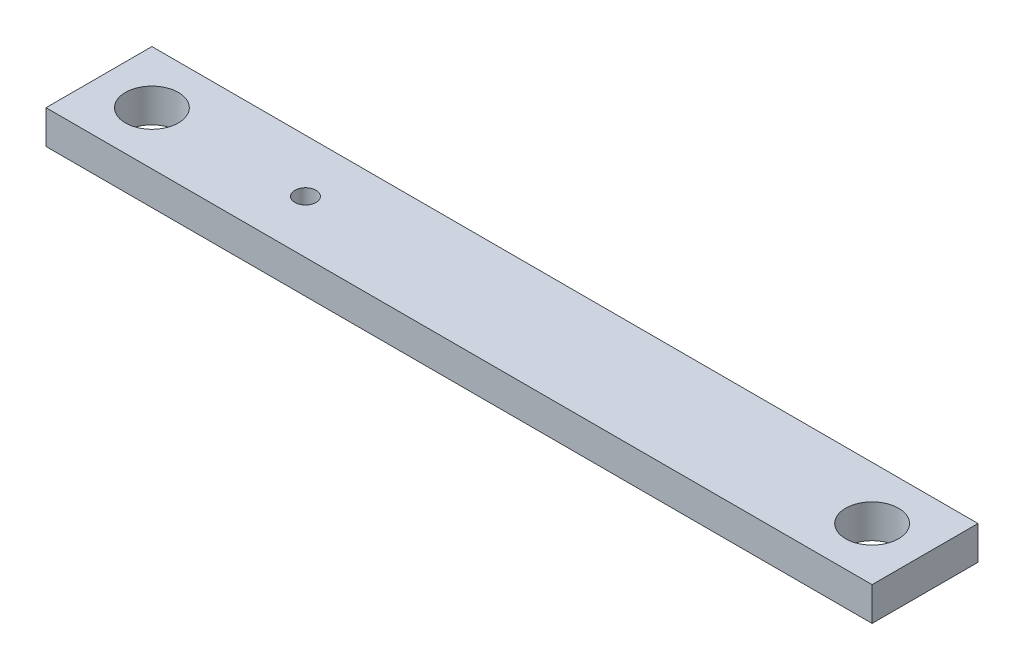
ISO-10303-21;
HEADER;
FILE_DESCRIPTION(('STEP AP214'),'2;1');
FILE_NAME('part.step','',(''),(''),'','','');
FILE_SCHEMA(('AUTOMOTIVE_DESIGN { 1 0 10303 214 1 1 1 1 }'));
ENDSEC;
DATA;
#1=APPLICATION_CONTEXT('core data for automotive mechanical design processes');
#2=APPLICATION_PROTOCOL_DEFINITION('international standard','automotive_design',2000,#1);
#3=PRODUCT_CONTEXT('',#1,'mechanical');
#4=PRODUCT('Part','Part','',(#3));
#5=PRODUCT_RELATED_PRODUCT_CATEGORY('part','',(#4));
#6=PRODUCT_DEFINITION_FORMATION('','',#4);
#7=PRODUCT_DEFINITION_CONTEXT('part definition',#1,'design');
#8=PRODUCT_DEFINITION('design','',#6,#7);
#9=PRODUCT_DEFINITION_SHAPE('','',#8);
#10=(LENGTH_UNIT() NAMED_UNIT(*) SI_UNIT(.MILLI.,.METRE.));
#11=(NAMED_UNIT(*) PLANE_ANGLE_UNIT() SI_UNIT($,.RADIAN.));
#12=(NAMED_UNIT(*) SI_UNIT($,.STERADIAN.) SOLID_ANGLE_UNIT());
#13=UNCERTAINTY_MEASURE_WITH_UNIT(LENGTH_MEASURE(1.E-05),#10,'distance_accuracy_value','');
#14=(GEOMETRIC_REPRESENTATION_CONTEXT(3) GLOBAL_UNCERTAINTY_ASSIGNED_CONTEXT((#13)) GLOBAL_UNIT_ASSIGNED_CONTEXT((#10,
#11,#12)) REPRESENTATION_CONTEXT('',''));
#15=CARTESIAN_POINT('',(0.,0.,0.));
#16=DIRECTION('',(0.,0.,1.));
#17=DIRECTION('',(1.,0.,0.));
#18=AXIS2_PLACEMENT_3D('',#15,#16,#17);
#19=CARTESIAN_POINT('',(39.,3.175,5.));
#20=DIRECTION('',(-1.,0.,0.));
#21=DIRECTION('',(0.,0.,1.));
#22=AXIS2_PLACEMENT_3D('',#19,#20,#21);
#23=PLANE('',#22);
#24=DIRECTION('',(0.,0.,-1.));
#25=VECTOR('',#24,1.);
#26=CARTESIAN_POINT('',(39.,0.,5.));
#27=LINE('',#26,#25);
#28=CARTESIAN_POINT('',(39.,0.,5.));
#29=VERTEX_POINT('',#28);
#30=CARTESIAN_POINT('',(39.,0.,-5.));
#31=VERTEX_POINT('',#30);
#32=EDGE_CURVE('E113',#29,#31,#27,.T.);
#33=ORIENTED_EDGE('',*,*,#32,.T.);
#34=DIRECTION('',(0.,-1.,0.));
#35=VECTOR('',#34,1.);
#36=CARTESIAN_POINT('',(39.,3.175,-5.));
#37=LINE('',#36,#35);
#38=CARTESIAN_POINT('',(39.,3.175,-5.));
#39=VERTEX_POINT('',#38);
#40=EDGE_CURVE('E11',#39,#31,#37,.T.);
#41=ORIENTED_EDGE('',*,*,#40,.F.);
#42=DIRECTION('',(0.,0.,-1.));
#43=VECTOR('',#42,1.);
#44=CARTESIAN_POINT('',(39.,3.175,5.));
#45=LINE('',#44,#43);
#46=CARTESIAN_POINT('',(39.,3.175,5.));
#47=VERTEX_POINT('',#46);
#48=EDGE_CURVE('E97',#47,#39,#45,.T.);
#49=ORIENTED_EDGE('',*,*,#48,.F.);
#50=DIRECTION('',(0.,-1.,0.));
#51=VECTOR('',#50,1.);
#52=CARTESIAN_POINT('',(39.,3.175,5.));
#53=LINE('',#52,#51);
#54=EDGE_CURVE('E109',#47,#29,#53,.T.);
#55=ORIENTED_EDGE('',*,*,#54,.T.);
#56=EDGE_LOOP('',(#33,#41,#49,#55));
#57=FACE_BOUND('',#56,.T.);
#58=ADVANCED_FACE('F45',(#57),#23,.F.);
#59=CARTESIAN_POINT('',(-39.,3.175,-5.));
#60=DIRECTION('',(0.,0.,1.));
#61=DIRECTION('',(1.,0.,0.));
#62=AXIS2_PLACEMENT_3D('',#59,#60,#61);
#63=PLANE('',#62);
#64=DIRECTION('',(-1.,0.,0.));
#65=VECTOR('',#64,1.);
#66=CARTESIAN_POINT('',(-39.,0.,-5.));
#67=LINE('',#66,#65);
#68=CARTESIAN_POINT('',(-39.,0.,-5.));
#69=VERTEX_POINT('',#68);
#70=EDGE_CURVE('E102',#31,#69,#67,.T.);
#71=ORIENTED_EDGE('',*,*,#70,.T.);
#72=DIRECTION('',(0.,-1.,0.));
#73=VECTOR('',#72,1.);
#74=CARTESIAN_POINT('',(-39.,3.175,-5.));
#75=LINE('',#74,#73);
#76=CARTESIAN_POINT('',(-39.,3.175,-5.));
#77=VERTEX_POINT('',#76);
#78=EDGE_CURVE('E54',#77,#69,#75,.T.);
#79=ORIENTED_EDGE('',*,*,#78,.F.);
#80=DIRECTION('',(-1.,0.,0.));
#81=VECTOR('',#80,1.);
#82=CARTESIAN_POINT('',(-39.,3.175,-5.));
#83=LINE('',#82,#81);
#84=EDGE_CURVE('E92',#39,#77,#83,.T.);
#85=ORIENTED_EDGE('',*,*,#84,.F.);
#86=ORIENTED_EDGE('',*,*,#40,.T.);
#87=EDGE_LOOP('',(#71,#79,#85,#86));
#88=FACE_BOUND('',#87,.T.);
#89=ADVANCED_FACE('F101',(#88),#63,.F.);
#90=CARTESIAN_POINT('',(-39.,3.175,5.));
#91=DIRECTION('',(1.,0.,0.));
#92=DIRECTION('',(0.,0.,-1.));
#93=AXIS2_PLACEMENT_3D('',#90,#91,#92);
#94=PLANE('',#93);
#95=DIRECTION('',(0.,0.,1.));
#96=VECTOR('',#95,1.);
#97=CARTESIAN_POINT('',(-39.,0.,5.));
#98=LINE('',#97,#96);
#99=CARTESIAN_POINT('',(-39.,0.,5.));
#100=VERTEX_POINT('',#99);
#101=EDGE_CURVE('E79',#69,#100,#98,.T.);
#102=ORIENTED_EDGE('',*,*,#101,.T.);
#103=DIRECTION('',(0.,-1.,0.));
#104=VECTOR('',#103,1.);
#105=CARTESIAN_POINT('',(-39.,3.175,5.));
#106=LINE('',#105,#104);
#107=CARTESIAN_POINT('',(-39.,3.175,5.));
#108=VERTEX_POINT('',#107);
#109=EDGE_CURVE('E104',#108,#100,#106,.T.);
#110=ORIENTED_EDGE('',*,*,#109,.F.);
#111=DIRECTION('',(0.,0.,1.));
#112=VECTOR('',#111,1.);
#113=CARTESIAN_POINT('',(-39.,3.175,5.));
#114=LINE('',#113,#112);
#115=EDGE_CURVE('E95',#77,#108,#114,.T.);
#116=ORIENTED_EDGE('',*,*,#115,.F.);
#117=ORIENTED_EDGE('',*,*,#78,.T.);
#118=EDGE_LOOP('',(#102,#110,#116,#117));
#119=FACE_BOUND('',#118,.T.);
#120=ADVANCED_FACE('F105',(#119),#94,.F.);
#121=CARTESIAN_POINT('',(-39.,3.175,5.));
#122=DIRECTION('',(0.,0.,-1.));
#123=DIRECTION('',(-1.,0.,0.));
#124=AXIS2_PLACEMENT_3D('',#121,#122,#123);
#125=PLANE('',#124);
#126=DIRECTION('',(1.,0.,0.));
#127=VECTOR('',#126,1.);
#128=CARTESIAN_POINT('',(-39.,0.,5.));
#129=LINE('',#128,#127);
#130=EDGE_CURVE('E85',#100,#29,#129,.T.);
#131=ORIENTED_EDGE('',*,*,#130,.T.);
#132=ORIENTED_EDGE('',*,*,#54,.F.);
#133=DIRECTION('',(1.,0.,0.));
#134=VECTOR('',#133,1.);
#135=CARTESIAN_POINT('',(-39.,3.175,5.));
#136=LINE('',#135,#134);
#137=EDGE_CURVE('E62',#108,#47,#136,.T.);
#138=ORIENTED_EDGE('',*,*,#137,.F.);
#139=ORIENTED_EDGE('',*,*,#109,.T.);
#140=EDGE_LOOP('',(#131,#132,#138,#139));
#141=FACE_BOUND('',#140,.T.);
#142=ADVANCED_FACE('F127',(#141),#125,.F.);
#143=CARTESIAN_POINT('',(0.,3.175,0.));
#144=DIRECTION('',(0.,-1.,0.));
#145=DIRECTION('',(0.,0.,-1.));
#146=AXIS2_PLACEMENT_3D('',#143,#144,#145);
#147=PLANE('',#146);
#148=CARTESIAN_POINT('',(-19.5,3.175,0.));
#149=DIRECTION('',(0.,1.,0.));
#150=DIRECTION('',(0.,0.,1.));
#151=AXIS2_PLACEMENT_3D('',#148,#149,#150);
#152=CIRCLE('',#151,1.);
#153=CARTESIAN_POINT('',(-19.5,3.175,1.));
#154=VERTEX_POINT('',#153);
#155=EDGE_CURVE('E143',#154,#154,#152,.T.);
#156=ORIENTED_EDGE('',*,*,#155,.F.);
#157=EDGE_LOOP('',(#156));
#158=FACE_BOUND('',#157,.T.);
#159=CARTESIAN_POINT('',(-34.,3.175,0.));
#160=DIRECTION('',(0.,1.,0.));
#161=DIRECTION('',(0.,0.,1.));
#162=AXIS2_PLACEMENT_3D('',#159,#160,#161);
#163=CIRCLE('',#162,2.5);
#164=CARTESIAN_POINT('',(-34.,3.175,2.5));
#165=VERTEX_POINT('',#164);
#166=EDGE_CURVE('E138',#165,#165,#163,.T.);
#167=ORIENTED_EDGE('',*,*,#166,.F.);
#168=EDGE_LOOP('',(#167));
#169=FACE_BOUND('',#168,.T.);
#170=CARTESIAN_POINT('',(34.,3.175,0.));
#171=DIRECTION('',(0.,1.,0.));
#172=DIRECTION('',(0.,0.,-1.));
#173=AXIS2_PLACEMENT_3D('',#170,#171,#172);
#174=CIRCLE('',#173,2.5);
#175=CARTESIAN_POINT('',(34.,3.175,-2.50000000000001));
#176=VERTEX_POINT('',#175);
#177=EDGE_CURVE('E134',#176,#176,#174,.T.);
#178=ORIENTED_EDGE('',*,*,#177,.F.);
#179=EDGE_LOOP('',(#178));
#180=FACE_BOUND('',#179,.T.);
#181=ORIENTED_EDGE('',*,*,#48,.T.);
#182=ORIENTED_EDGE('',*,*,#84,.T.);
#183=ORIENTED_EDGE('',*,*,#115,.T.);
#184=ORIENTED_EDGE('',*,*,#137,.T.);
#185=EDGE_LOOP('',(#181,#182,#183,#184));
#186=FACE_BOUND('',#185,.T.);
#187=ADVANCED_FACE('F93',(#158,#169,#180,#186),#147,.F.);
#188=CARTESIAN_POINT('',(0.,0.,0.));
#189=DIRECTION('',(0.,-1.,0.));
#190=DIRECTION('',(0.,0.,-1.));
#191=AXIS2_PLACEMENT_3D('',#188,#189,#190);
#192=PLANE('',#191);
#193=CARTESIAN_POINT('',(-19.5,0.,0.));
#194=DIRECTION('',(0.,-1.,0.));
#195=DIRECTION('',(0.,0.,-1.));
#196=AXIS2_PLACEMENT_3D('',#193,#194,#195);
#197=CIRCLE('',#196,1.);
#198=CARTESIAN_POINT('',(-19.5,0.,-1.));
#199=VERTEX_POINT('',#198);
#200=EDGE_CURVE('E150',#199,#199,#197,.F.);
#201=ORIENTED_EDGE('',*,*,#200,.T.);
#202=EDGE_LOOP('',(#201));
#203=FACE_BOUND('',#202,.T.);
#204=CARTESIAN_POINT('',(-34.,0.,0.));
#205=DIRECTION('',(0.,-1.,0.));
#206=DIRECTION('',(0.,0.,-1.));
#207=AXIS2_PLACEMENT_3D('',#204,#205,#206);
#208=CIRCLE('',#207,2.5);
#209=CARTESIAN_POINT('',(-34.,0.,-2.5));
#210=VERTEX_POINT('',#209);
#211=EDGE_CURVE('E117',#210,#210,#208,.F.);
#212=ORIENTED_EDGE('',*,*,#211,.T.);
#213=EDGE_LOOP('',(#212));
#214=FACE_BOUND('',#213,.T.);
#215=CARTESIAN_POINT('',(34.,0.,0.));
#216=DIRECTION('',(0.,-1.,0.));
#217=DIRECTION('',(0.,0.,-1.));
#218=AXIS2_PLACEMENT_3D('',#215,#216,#217);
#219=CIRCLE('',#218,2.5);
#220=CARTESIAN_POINT('',(34.,0.,-2.50000000000001));
#221=VERTEX_POINT('',#220);
#222=EDGE_CURVE('E139',#221,#221,#219,.F.);
#223=ORIENTED_EDGE('',*,*,#222,.T.);
#224=EDGE_LOOP('',(#223));
#225=FACE_BOUND('',#224,.T.);
#226=ORIENTED_EDGE('',*,*,#32,.F.);
#227=ORIENTED_EDGE('',*,*,#130,.F.);
#228=ORIENTED_EDGE('',*,*,#101,.F.);
#229=ORIENTED_EDGE('',*,*,#70,.F.);
#230=EDGE_LOOP('',(#226,#227,#228,#229));
#231=FACE_BOUND('',#230,.T.);
#232=ADVANCED_FACE('F130',(#203,#214,#225,#231),#192,.T.);
#233=CARTESIAN_POINT('',(34.,-7.07106781186548,0.));
#234=DIRECTION('',(0.,1.,0.));
#235=DIRECTION('',(0.,0.,1.));
#236=AXIS2_PLACEMENT_3D('',#233,#234,#235);
#237=CYLINDRICAL_SURFACE('',#236,2.5);
#238=ORIENTED_EDGE('',*,*,#177,.T.);
#239=EDGE_LOOP('',(#238));
#240=FACE_BOUND('',#239,.T.);
#241=ORIENTED_EDGE('',*,*,#222,.F.);
#242=EDGE_LOOP('',(#241));
#243=FACE_BOUND('',#242,.T.);
#244=ADVANCED_FACE('F167',(#240,#243),#237,.F.);
#245=CARTESIAN_POINT('',(-34.,-7.07106781186548,0.));
#246=DIRECTION('',(0.,1.,0.));
#247=DIRECTION('',(0.,0.,1.));
#248=AXIS2_PLACEMENT_3D('',#245,#246,#247);
#249=CYLINDRICAL_SURFACE('',#248,2.5);
#250=ORIENTED_EDGE('',*,*,#166,.T.);
#251=EDGE_LOOP('',(#250));
#252=FACE_BOUND('',#251,.T.);
#253=ORIENTED_EDGE('',*,*,#211,.F.);
#254=EDGE_LOOP('',(#253));
#255=FACE_BOUND('',#254,.T.);
#256=ADVANCED_FACE('F170',(#252,#255),#249,.F.);
#257=CARTESIAN_POINT('',(-19.5,-0.00100000000000013,0.));
#258=DIRECTION('',(0.,1.,0.));
#259=DIRECTION('',(0.,0.,1.));
#260=AXIS2_PLACEMENT_3D('',#257,#258,#259);
#261=CYLINDRICAL_SURFACE('',#260,1.);
#262=ORIENTED_EDGE('',*,*,#200,.F.);
#263=EDGE_LOOP('',(#262));
#264=FACE_BOUND('',#263,.T.);
#265=ORIENTED_EDGE('',*,*,#155,.T.);
#266=EDGE_LOOP('',(#265));
#267=FACE_BOUND('',#266,.T.);
#268=ADVANCED_FACE('F158',(#264,#267),#261,.F.);
#269=CLOSED_SHELL('',(#58,#89,#120,#142,#187,#232,#244,#256,#268));
#270=MANIFOLD_SOLID_BREP('B2',#269);
#271=ADVANCED_BREP_SHAPE_REPRESENTATION('',(#18,#270),#14);
#272=SHAPE_DEFINITION_REPRESENTATION(#9,#271);
ENDSEC;
END-ISO-10303-21;
